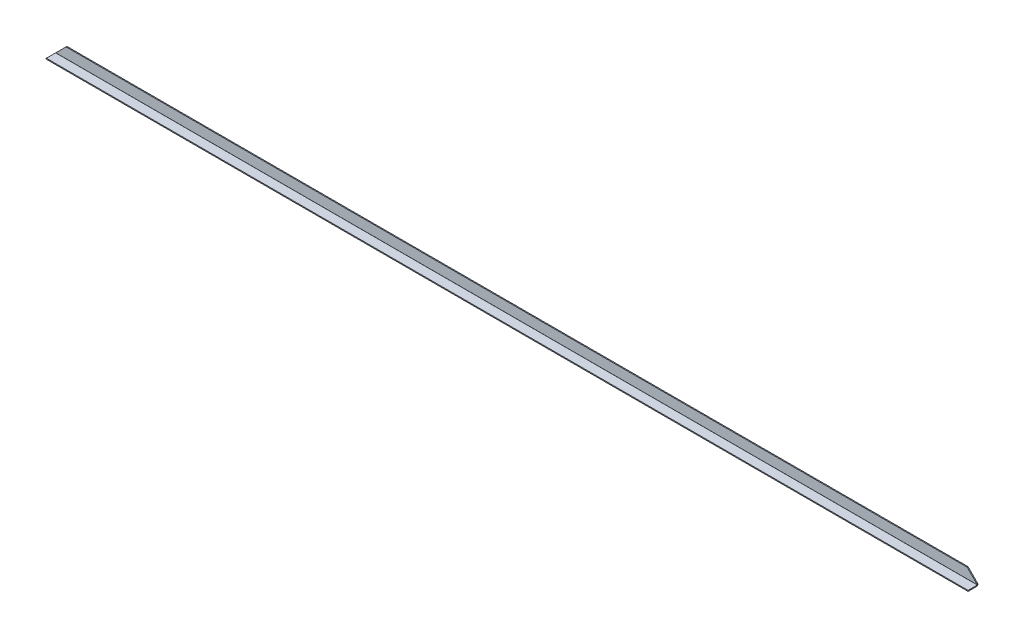
ISO-10303-21;
HEADER;
FILE_DESCRIPTION(('STEP AP214'),'2;1');
FILE_NAME('part.step','',(''),(''),'','','');
FILE_SCHEMA(('AUTOMOTIVE_DESIGN { 1 0 10303 214 1 1 1 1 }'));
ENDSEC;
DATA;
#1=APPLICATION_CONTEXT('core data for automotive mechanical design processes');
#2=APPLICATION_PROTOCOL_DEFINITION('international standard','automotive_design',2000,#1);
#3=PRODUCT_CONTEXT('',#1,'mechanical');
#4=PRODUCT('Part','Part','',(#3));
#5=PRODUCT_RELATED_PRODUCT_CATEGORY('part','',(#4));
#6=PRODUCT_DEFINITION_FORMATION('','',#4);
#7=PRODUCT_DEFINITION_CONTEXT('part definition',#1,'design');
#8=PRODUCT_DEFINITION('design','',#6,#7);
#9=PRODUCT_DEFINITION_SHAPE('','',#8);
#10=(LENGTH_UNIT() NAMED_UNIT(*) SI_UNIT(.MILLI.,.METRE.));
#11=(NAMED_UNIT(*) PLANE_ANGLE_UNIT() SI_UNIT($,.RADIAN.));
#12=(NAMED_UNIT(*) SI_UNIT($,.STERADIAN.) SOLID_ANGLE_UNIT());
#13=UNCERTAINTY_MEASURE_WITH_UNIT(LENGTH_MEASURE(1.E-05),#10,'distance_accuracy_value','');
#14=(GEOMETRIC_REPRESENTATION_CONTEXT(3) GLOBAL_UNCERTAINTY_ASSIGNED_CONTEXT((#13)) GLOBAL_UNIT_ASSIGNED_CONTEXT((#10,
#11,#12)) REPRESENTATION_CONTEXT('',''));
#15=CARTESIAN_POINT('',(0.,0.,0.));
#16=DIRECTION('',(0.,0.,1.));
#17=DIRECTION('',(1.,0.,0.));
#18=AXIS2_PLACEMENT_3D('',#15,#16,#17);
#19=CARTESIAN_POINT('',(-739.292893218814,3038.20647379484,684.763400000009));
#20=CARTESIAN_POINT('',(-739.49582060574,3038.20647379484,685.005588943309));
#21=CARTESIAN_POINT('',(-739.698563593734,3038.20647379484,685.247925149457));
#22=CARTESIAN_POINT('',(-739.889112089741,3038.20647379484,685.50000000001));
#23=B_SPLINE_CURVE_WITH_KNOTS('',3,(#19,#20,#21,#22),.UNSPECIFIED.,.F.,.F.,(4,4),(0.,1.),.UNSPECIFIED.);
#24=DIRECTION('',(0.,-1.,0.));
#25=VECTOR('',#24,1.);
#26=SURFACE_OF_LINEAR_EXTRUSION('',#23,#25);
#27=CARTESIAN_POINT('',(-739.889112089741,78.4999999999992,685.5));
#28=CARTESIAN_POINT('',(-739.84146622922,78.4999999999992,685.436969176551));
#29=CARTESIAN_POINT('',(-739.793050682681,78.4999999999992,685.374538727169));
#30=CARTESIAN_POINT('',(-739.695065923463,78.4999999999992,685.250590938683));
#31=CARTESIAN_POINT('',(-739.645496745226,78.4999999999992,685.189073572407));
#32=CARTESIAN_POINT('',(-739.495687734224,78.4999999999992,685.005521232717));
#33=CARTESIAN_POINT('',(-739.394293320919,78.4999999999992,684.884417517852));
#34=CARTESIAN_POINT('',(-739.292893218813,78.4999999999992,684.763399999999));
#35=B_SPLINE_CURVE_WITH_KNOTS('',3,(#27,#28,#29,#30,#31,#32,#33,#34),.UNSPECIFIED.,.F.,.F.,(4,2,
2,4),(0.,0.237008652066105,0.474010237128445,0.94775344184367),.UNSPECIFIED.);
#36=CARTESIAN_POINT('',(-739.889112089741,78.4999999999993,685.5));
#37=VERTEX_POINT('',#36);
#38=CARTESIAN_POINT('',(-739.292893218813,78.4999999999995,684.763399999989));
#39=VERTEX_POINT('',#38);
#40=EDGE_CURVE('E630',#37,#39,#35,.T.);
#41=ORIENTED_EDGE('',*,*,#40,.F.);
#42=DIRECTION('',(0.,-1.,0.));
#43=VECTOR('',#42,1.);
#44=CARTESIAN_POINT('',(-739.889112089741,3038.20647379484,685.50000000001));
#45=LINE('',#44,#43);
#46=CARTESIAN_POINT('',(-739.889112089741,79.9999999999996,685.5));
#47=VERTEX_POINT('',#46);
#48=EDGE_CURVE('E778',#47,#37,#45,.T.);
#49=ORIENTED_EDGE('',*,*,#48,.F.);
#50=CARTESIAN_POINT('',(-739.292893218813,79.9999999999993,684.763399999999));
#51=CARTESIAN_POINT('',(-739.49582060574,79.9999999999993,685.005588943299));
#52=CARTESIAN_POINT('',(-739.698563593734,79.9999999999993,685.247925149447));
#53=CARTESIAN_POINT('',(-739.889112089741,79.9999999999993,685.5));
#54=B_SPLINE_CURVE_WITH_KNOTS('',3,(#50,#51,#52,#53),.UNSPECIFIED.,.F.,.F.,(4,4),(0.,1.),.UNSPECIFIED.);
#55=CARTESIAN_POINT('',(-739.292893218813,79.9999999999996,684.763399999989));
#56=VERTEX_POINT('',#55);
#57=EDGE_CURVE('E73',#56,#47,#54,.T.);
#58=ORIENTED_EDGE('',*,*,#57,.F.);
#59=DIRECTION('',(0.,-1.,0.));
#60=VECTOR('',#59,1.);
#61=CARTESIAN_POINT('',(-739.292893218814,3038.20647379484,684.763399999999));
#62=LINE('',#61,#60);
#63=EDGE_CURVE('E727',#56,#39,#62,.T.);
#64=ORIENTED_EDGE('',*,*,#63,.T.);
#65=EDGE_LOOP('',(#41,#49,#58,#64));
#66=FACE_BOUND('',#65,.T.);
#67=ADVANCED_FACE('F59',(#66),#26,.F.);
#68=CARTESIAN_POINT('',(-2.52700651828484E-13,3038.20647379484,685.50000000001));
#69=DIRECTION('',(0.,0.,-1.));
#70=DIRECTION('',(0.,1.,0.));
#71=AXIS2_PLACEMENT_3D('',#68,#69,#70);
#72=PLANE('',#71);
#73=DIRECTION('',(-1.,0.,0.));
#74=VECTOR('',#73,1.);
#75=CARTESIAN_POINT('',(1.0871812735546E-13,78.4999999999996,685.5));
#76=LINE('',#75,#74);
#77=CARTESIAN_POINT('',(739.889112089738,78.4999999999996,685.499999999999));
#78=VERTEX_POINT('',#77);
#79=EDGE_CURVE('E730',#37,#78,#76,.F.);
#80=ORIENTED_EDGE('',*,*,#79,.T.);
#81=DIRECTION('',(0.,-1.,0.));
#82=VECTOR('',#81,1.);
#83=CARTESIAN_POINT('',(739.889112089738,3038.20647379484,685.500000000009));
#84=LINE('',#83,#82);
#85=CARTESIAN_POINT('',(739.889112089738,80.0000000000001,685.499999999999));
#86=VERTEX_POINT('',#85);
#87=EDGE_CURVE('E758',#86,#78,#84,.T.);
#88=ORIENTED_EDGE('',*,*,#87,.F.);
#89=DIRECTION('',(1.,0.,0.));
#90=VECTOR('',#89,1.);
#91=CARTESIAN_POINT('',(1.0853501492339E-13,79.9999999999996,685.5));
#92=LINE('',#91,#90);
#93=EDGE_CURVE('E14',#47,#86,#92,.T.);
#94=ORIENTED_EDGE('',*,*,#93,.F.);
#95=ORIENTED_EDGE('',*,*,#48,.T.);
#96=EDGE_LOOP('',(#80,#88,#94,#95));
#97=FACE_BOUND('',#96,.T.);
#98=ADVANCED_FACE('F565',(#97),#72,.F.);
#99=CARTESIAN_POINT('',(739.292893218813,3038.20647379484,684.76340000001));
#100=CARTESIAN_POINT('',(739.495796147437,3038.20647379484,685.005559752914));
#101=CARTESIAN_POINT('',(739.698625733102,3038.20647379484,685.248007353056));
#102=CARTESIAN_POINT('',(739.889112089738,3038.20647379484,685.500000000007));
#103=B_SPLINE_CURVE_WITH_KNOTS('',3,(#99,#100,#101,#102),.UNSPECIFIED.,.F.,.F.,(4,4),(0.,1.),.UNSPECIFIED.);
#104=DIRECTION('',(0.,-1.,0.));
#105=VECTOR('',#104,1.);
#106=SURFACE_OF_LINEAR_EXTRUSION('',#103,#105);
#107=ORIENTED_EDGE('',*,*,#87,.T.);
#108=CARTESIAN_POINT('',(739.889112089738,78.4999999999995,685.499999999997));
#109=CARTESIAN_POINT('',(739.841449125809,78.4999999999997,685.43694726729));
#110=CARTESIAN_POINT('',(739.793015983584,78.4999999999998,685.374495306884));
#111=CARTESIAN_POINT('',(739.694995515861,78.5,685.250504933533));
#112=CARTESIAN_POINT('',(739.645408224944,78.4999999999999,685.188966493307));
#113=CARTESIAN_POINT('',(739.495615047362,78.4999999999998,685.00543711312));
#114=CARTESIAN_POINT('',(739.394256653781,78.4999999999997,684.884375779889));
#115=CARTESIAN_POINT('',(739.292893218814,78.4999999999999,684.7634));
#116=B_SPLINE_CURVE_WITH_KNOTS('',3,(#108,#109,#110,#111,#112,#113,#114,#115),.UNSPECIFIED.,.F.,
.F.,(4,2,2,4),(0.,0.237091997989097,0.474176901016718,0.947753395880619),.UNSPECIFIED.);
#117=CARTESIAN_POINT('',(739.292893218814,78.4999999999999,684.76339999999));
#118=VERTEX_POINT('',#117);
#119=EDGE_CURVE('E623',#78,#118,#116,.T.);
#120=ORIENTED_EDGE('',*,*,#119,.T.);
#121=DIRECTION('',(0.,-1.,0.));
#122=VECTOR('',#121,1.);
#123=CARTESIAN_POINT('',(739.292893218813,3038.20647379484,684.7634));
#124=LINE('',#123,#122);
#125=CARTESIAN_POINT('',(739.292893218814,79.9999999999996,684.76339999999));
#126=VERTEX_POINT('',#125);
#127=EDGE_CURVE('E756',#126,#118,#124,.T.);
#128=ORIENTED_EDGE('',*,*,#127,.F.);
#129=CARTESIAN_POINT('',(739.292893218814,79.9999999999995,684.7634));
#130=CARTESIAN_POINT('',(739.495796147437,79.9999999999995,685.005559752904));
#131=CARTESIAN_POINT('',(739.698625733102,79.9999999999995,685.248007353046));
#132=CARTESIAN_POINT('',(739.889112089738,79.9999999999995,685.499999999997));
#133=B_SPLINE_CURVE_WITH_KNOTS('',3,(#129,#130,#131,#132),.UNSPECIFIED.,.F.,.F.,(4,4),(0.,1.),.UNSPECIFIED.);
#134=EDGE_CURVE('E760',#126,#86,#133,.T.);
#135=ORIENTED_EDGE('',*,*,#134,.T.);
#136=EDGE_LOOP('',(#107,#120,#128,#135));
#137=FACE_BOUND('',#136,.T.);
#138=ADVANCED_FACE('F570',(#137),#106,.T.);
#139=CARTESIAN_POINT('',(739.292893218813,3038.20647379484,9.99200722162641E-12));
#140=DIRECTION('',(1.,0.,0.));
#141=DIRECTION('',(0.,-1.,0.));
#142=AXIS2_PLACEMENT_3D('',#139,#140,#141);
#143=PLANE('',#142);
#144=ORIENTED_EDGE('',*,*,#127,.T.);
#145=DIRECTION('',(0.,0.,1.));
#146=VECTOR('',#145,1.);
#147=CARTESIAN_POINT('',(739.292893218814,78.4999999999999,685.5));
#148=LINE('',#147,#146);
#149=CARTESIAN_POINT('',(739.292893218814,78.4999999999997,671.23659999999));
#150=VERTEX_POINT('',#149);
#151=EDGE_CURVE('E641',#150,#118,#148,.T.);
#152=ORIENTED_EDGE('',*,*,#151,.F.);
#153=DIRECTION('',(0.,-1.,0.));
#154=VECTOR('',#153,1.);
#155=CARTESIAN_POINT('',(739.292893218814,3038.20647379484,671.2366));
#156=LINE('',#155,#154);
#157=CARTESIAN_POINT('',(739.292893218814,79.9999999999998,671.23659999999));
#158=VERTEX_POINT('',#157);
#159=EDGE_CURVE('E640',#158,#150,#156,.T.);
#160=ORIENTED_EDGE('',*,*,#159,.F.);
#161=DIRECTION('',(0.,0.,-1.));
#162=VECTOR('',#161,1.);
#163=CARTESIAN_POINT('',(739.292893218814,80.0000000000022,1.11022302462516E-13));
#164=LINE('',#163,#162);
#165=EDGE_CURVE('E762',#158,#126,#164,.F.);
#166=ORIENTED_EDGE('',*,*,#165,.T.);
#167=EDGE_LOOP('',(#144,#152,#160,#166));
#168=FACE_BOUND('',#167,.T.);
#169=ADVANCED_FACE('F576',(#168),#143,.T.);
#170=CARTESIAN_POINT('',(-739.292893218814,3038.20647379484,9.88098491916389E-12));
#171=DIRECTION('',(-1.,0.,0.));
#172=DIRECTION('',(0.,1.,0.));
#173=AXIS2_PLACEMENT_3D('',#170,#171,#172);
#174=PLANE('',#173);
#175=DIRECTION('',(0.,-1.,0.));
#176=VECTOR('',#175,1.);
#177=CARTESIAN_POINT('',(-739.292893218814,3038.20647379484,671.2366));
#178=LINE('',#177,#176);
#179=CARTESIAN_POINT('',(-739.292893218813,79.9999999999997,671.23659999999));
#180=VERTEX_POINT('',#179);
#181=CARTESIAN_POINT('',(-739.292893218813,78.4999999999995,671.23659999999));
#182=VERTEX_POINT('',#181);
#183=EDGE_CURVE('E767',#180,#182,#178,.T.);
#184=ORIENTED_EDGE('',*,*,#183,.T.);
#185=DIRECTION('',(0.,0.,1.));
#186=VECTOR('',#185,1.);
#187=CARTESIAN_POINT('',(-739.292893218813,78.4999999999996,685.5));
#188=LINE('',#187,#186);
#189=EDGE_CURVE('E673',#182,#39,#188,.T.);
#190=ORIENTED_EDGE('',*,*,#189,.T.);
#191=ORIENTED_EDGE('',*,*,#63,.F.);
#192=DIRECTION('',(0.,0.,-1.));
#193=VECTOR('',#192,1.);
#194=CARTESIAN_POINT('',(-739.292893218813,80.0000000000017,0.));
#195=LINE('',#194,#193);
#196=EDGE_CURVE('E665',#56,#180,#195,.T.);
#197=ORIENTED_EDGE('',*,*,#196,.T.);
#198=EDGE_LOOP('',(#184,#190,#191,#197));
#199=FACE_BOUND('',#198,.T.);
#200=ADVANCED_FACE('F601',(#199),#174,.T.);
#201=CARTESIAN_POINT('',(-739.292893218814,3038.20647379484,671.23660000001));
#202=CARTESIAN_POINT('',(-739.228205357178,3038.20647379484,671.134988544564));
#203=CARTESIAN_POINT('',(-739.163789295496,3038.20647379484,671.033215513255));
#204=CARTESIAN_POINT('',(-739.049089486867,3038.20647379484,670.821268268284));
#205=CARTESIAN_POINT('',(-738.999467610727,3038.20647379484,670.71191123986));
#206=CARTESIAN_POINT('',(-738.958683089955,3038.20647379484,670.600000000011));
#207=B_SPLINE_CURVE_WITH_KNOTS('',3,(#201,#202,#203,#204,#205,#206),.UNSPECIFIED.,.F.,.F.,(4,2,
4),(0.,0.5,1.),.UNSPECIFIED.);
#208=DIRECTION('',(0.,-1.,0.));
#209=VECTOR('',#208,1.);
#210=SURFACE_OF_LINEAR_EXTRUSION('',#207,#209);
#211=CARTESIAN_POINT('',(-738.958683089955,79.9999999999996,670.600000000001));
#212=DIRECTION('',(0.,-1.,0.));
#213=VECTOR('',#212,1.);
#214=LINE('',#211,#213);
#215=CARTESIAN_POINT('',(-738.958683089955,79.9999999999997,670.6));
#216=VERTEX_POINT('',#215);
#217=CARTESIAN_POINT('',(-738.958683089955,78.4999999999997,670.6));
#218=VERTEX_POINT('',#217);
#219=EDGE_CURVE('E672',#216,#218,#214,.T.);
#220=ORIENTED_EDGE('',*,*,#219,.T.);
#221=CARTESIAN_POINT('',(-738.957214469815,78.4999999998647,670.595970159815));
#222=CARTESIAN_POINT('',(-738.977750027755,78.4999999999507,670.652672024681));
#223=CARTESIAN_POINT('',(-739.000512448546,78.4999999999862,670.708557195652));
#224=CARTESIAN_POINT('',(-739.050092968141,78.5000000000124,670.818501749676));
#225=CARTESIAN_POINT('',(-739.076911025755,78.5000000000031,670.872561151267));
#226=CARTESIAN_POINT('',(-739.134290758396,78.4999999999956,670.97882136105));
#227=CARTESIAN_POINT('',(-739.164863374451,78.4999999999975,671.031016136442));
#228=CARTESIAN_POINT('',(-739.22791548687,78.5000000000012,671.134375756717));
#229=CARTESIAN_POINT('',(-739.260398099976,78.5000000000031,671.185538724355));
#230=CARTESIAN_POINT('',(-739.292893218813,78.4999999999993,671.2366));
#231=B_SPLINE_CURVE_WITH_KNOTS('',3,(#221,#222,#223,#224,#225,#226,#227,#228,#229,#230),
.UNSPECIFIED.,.F.,.F.,(4,2,2,2,4),(0.,0.18086525989436,0.361728682967934,0.543132250131995,
0.724840522158535),.UNSPECIFIED.);
#232=EDGE_CURVE('E707',#218,#182,#231,.T.);
#233=ORIENTED_EDGE('',*,*,#232,.T.);
#234=ORIENTED_EDGE('',*,*,#183,.F.);
#235=CARTESIAN_POINT('',(-739.292893218813,79.9999999999996,671.2366));
#236=CARTESIAN_POINT('',(-739.228205357178,79.9999999999996,671.134988544554));
#237=CARTESIAN_POINT('',(-739.163789295495,79.9999999999996,671.033215513245));
#238=CARTESIAN_POINT('',(-739.049089486867,79.9999999999996,670.821268268274));
#239=CARTESIAN_POINT('',(-738.999467610726,79.9999999999996,670.71191123985));
#240=CARTESIAN_POINT('',(-738.958683089955,79.9999999999996,670.600000000001));
#241=B_SPLINE_CURVE_WITH_KNOTS('',3,(#235,#236,#237,#238,#239,#240),.UNSPECIFIED.,.F.,.F.,(4,2,
4),(0.,0.5,1.),.UNSPECIFIED.);
#242=EDGE_CURVE('E703',#180,#216,#241,.T.);
#243=ORIENTED_EDGE('',*,*,#242,.T.);
#244=EDGE_LOOP('',(#220,#233,#234,#243));
#245=FACE_BOUND('',#244,.T.);
#246=ADVANCED_FACE('F596',(#245),#210,.T.);
#247=CARTESIAN_POINT('',(0.,78.5000000000019,1.11022302462516E-13));
#248=DIRECTION('',(0.,-1.,0.));
#249=DIRECTION('',(0.,0.,-1.));
#250=AXIS2_PLACEMENT_3D('',#247,#248,#249);
#251=PLANE('',#250);
#252=DIRECTION('',(-1.,0.,0.));
#253=VECTOR('',#252,1.);
#254=CARTESIAN_POINT('',(-738.958683089955,78.4999999999995,670.6));
#255=LINE('',#254,#253);
#256=CARTESIAN_POINT('',(738.958683089955,78.4999999999998,670.6));
#257=VERTEX_POINT('',#256);
#258=EDGE_CURVE('E722',#257,#218,#255,.T.);
#259=ORIENTED_EDGE('',*,*,#258,.F.);
#260=CARTESIAN_POINT('',(738.958683089955,78.4999999999996,670.6));
#261=CARTESIAN_POINT('',(738.968988421705,78.4999999999998,670.628279873762));
#262=CARTESIAN_POINT('',(738.979844085021,78.4999999999998,670.656357906757));
#263=CARTESIAN_POINT('',(739.002602043233,78.4999999999997,670.712063947291));
#264=CARTESIAN_POINT('',(739.014503603506,78.4999999999996,670.739692254797));
#265=CARTESIAN_POINT('',(739.039314285796,78.4999999999996,670.794493027585));
#266=CARTESIAN_POINT('',(739.05222344598,78.4999999999997,670.821665475551));
#267=CARTESIAN_POINT('',(739.079014678656,78.4999999999997,670.875542160706));
#268=CARTESIAN_POINT('',(739.092897166584,78.4999999999996,670.90224619181));
#269=CARTESIAN_POINT('',(739.13579419548,78.4999999999995,670.981425612631));
#270=CARTESIAN_POINT('',(739.166148138539,78.4999999999996,671.033165052155));
#271=CARTESIAN_POINT('',(739.228628658942,78.4999999999998,671.135503833935));
#272=CARTESIAN_POINT('',(739.260753405403,78.4999999999999,671.186104280306));
#273=CARTESIAN_POINT('',(739.292893218814,78.4999999999996,671.2366));
#274=B_SPLINE_CURVE_WITH_KNOTS('',3,(#260,#261,#262,#263,#264,#265,#266,#267,#268,#269,#270,
#271,#272,#273),.UNSPECIFIED.,.F.,.F.,(4,2,2,2,2,2,4),(0.,0.0902896640641582,0.180516409364814,
0.270746574151959,0.36101548826537,0.540906287238857,0.720614459105043),.UNSPECIFIED.);
#275=EDGE_CURVE('E706',#257,#150,#274,.T.);
#276=ORIENTED_EDGE('',*,*,#275,.T.);
#277=ORIENTED_EDGE('',*,*,#151,.T.);
#278=ORIENTED_EDGE('',*,*,#119,.F.);
#279=ORIENTED_EDGE('',*,*,#79,.F.);
#280=ORIENTED_EDGE('',*,*,#40,.T.);
#281=ORIENTED_EDGE('',*,*,#189,.F.);
#282=ORIENTED_EDGE('',*,*,#232,.F.);
#283=EDGE_LOOP('',(#259,#276,#277,#278,#279,#280,#281,#282));
#284=FACE_BOUND('',#283,.T.);
#285=ADVANCED_FACE('F600',(#284),#251,.T.);
#286=CARTESIAN_POINT('',(739.292893218813,3038.20647379484,671.23660000001));
#287=CARTESIAN_POINT('',(739.228342799945,3038.20647379484,671.135204439158));
#288=CARTESIAN_POINT('',(739.164061592684,3038.20647379484,671.033649018221));
#289=CARTESIAN_POINT('',(739.049552558149,3038.20647379484,670.822193162719));
#290=CARTESIAN_POINT('',(738.99977654488,3038.20647379484,670.712758943928));
#291=CARTESIAN_POINT('',(738.958683089954,3038.20647379484,670.60000000001));
#292=B_SPLINE_CURVE_WITH_KNOTS('',3,(#286,#287,#288,#289,#290,#291),.UNSPECIFIED.,.F.,.F.,(4,2,
4),(0.,0.5,1.),.UNSPECIFIED.);
#293=DIRECTION('',(0.,-1.,0.));
#294=VECTOR('',#293,1.);
#295=SURFACE_OF_LINEAR_EXTRUSION('',#292,#294);
#296=ORIENTED_EDGE('',*,*,#275,.F.);
#297=CARTESIAN_POINT('',(738.958683089955,79.9999999999996,670.6));
#298=CARTESIAN_POINT('',(738.958683089955,78.4999999999997,670.6));
#299=B_SPLINE_CURVE_WITH_KNOTS('',1,(#297,#298),.UNSPECIFIED.,.F.,.F.,(2,2),(0.,1.),.UNSPECIFIED.);
#300=CARTESIAN_POINT('',(738.958683089955,79.9999999999997,670.6));
#301=VERTEX_POINT('',#300);
#302=EDGE_CURVE('E86',#301,#257,#299,.T.);
#303=ORIENTED_EDGE('',*,*,#302,.F.);
#304=CARTESIAN_POINT('',(739.292893218814,79.9999999999998,671.2366));
#305=CARTESIAN_POINT('',(739.228342799946,79.9999999999998,671.135204439149));
#306=CARTESIAN_POINT('',(739.164061592684,79.9999999999998,671.033649018212));
#307=CARTESIAN_POINT('',(739.049552558149,79.9999999999998,670.822193162709));
#308=CARTESIAN_POINT('',(738.99977654488,79.9999999999998,670.712758943918));
#309=CARTESIAN_POINT('',(738.958683089955,79.9999999999998,670.6));
#310=B_SPLINE_CURVE_WITH_KNOTS('',3,(#304,#305,#306,#307,#308,#309),.UNSPECIFIED.,.F.,.F.,(4,2,
4),(0.,0.5,1.),.UNSPECIFIED.);
#311=EDGE_CURVE('E692',#158,#301,#310,.T.);
#312=ORIENTED_EDGE('',*,*,#311,.F.);
#313=ORIENTED_EDGE('',*,*,#159,.T.);
#314=EDGE_LOOP('',(#296,#303,#312,#313));
#315=FACE_BOUND('',#314,.T.);
#316=ADVANCED_FACE('F607',(#315),#295,.F.);
#317=CARTESIAN_POINT('',(0.,80.000000000002,1.11022302462516E-13));
#318=DIRECTION('',(0.,-1.,0.));
#319=DIRECTION('',(0.,0.,-1.));
#320=AXIS2_PLACEMENT_3D('',#317,#318,#319);
#321=PLANE('',#320);
#322=ORIENTED_EDGE('',*,*,#311,.T.);
#323=DIRECTION('',(-1.,0.,0.));
#324=VECTOR('',#323,1.);
#325=CARTESIAN_POINT('',(-738.958683089955,79.9999999999995,670.6));
#326=LINE('',#325,#324);
#327=EDGE_CURVE('E556',#301,#216,#326,.T.);
#328=ORIENTED_EDGE('',*,*,#327,.T.);
#329=ORIENTED_EDGE('',*,*,#242,.F.);
#330=ORIENTED_EDGE('',*,*,#196,.F.);
#331=ORIENTED_EDGE('',*,*,#57,.T.);
#332=ORIENTED_EDGE('',*,*,#93,.T.);
#333=ORIENTED_EDGE('',*,*,#134,.F.);
#334=ORIENTED_EDGE('',*,*,#165,.F.);
#335=EDGE_LOOP('',(#322,#328,#329,#330,#331,#332,#333,#334));
#336=FACE_BOUND('',#335,.T.);
#337=ADVANCED_FACE('F649',(#336),#321,.F.);
#338=CARTESIAN_POINT('',(0.,4.44089209850063E-12,669.000000000001));
#339=DIRECTION('',(0.,0.,1.));
#340=DIRECTION('',(0.,-1.,0.));
#341=AXIS2_PLACEMENT_3D('',#338,#339,#340);
#342=PLANE('',#341);
#343=CARTESIAN_POINT('',(-738.556293218814,80.7366000000002,669.));
#344=CARTESIAN_POINT('',(-738.60073725551,80.5246223952162,669.));
#345=CARTESIAN_POINT('',(-738.645086645381,80.3126256549142,669.));
#346=CARTESIAN_POINT('',(-738.686325339561,80.0999999999996,669.));
#347=B_SPLINE_CURVE_WITH_KNOTS('',3,(#343,#344,#345,#346),.UNSPECIFIED.,.F.,.F.,(4,4),(0.,1.),.UNSPECIFIED.);
#348=CARTESIAN_POINT('',(-738.556293218809,80.7366000000051,669.));
#349=VERTEX_POINT('',#348);
#350=CARTESIAN_POINT('',(-738.686325339561,80.1,669.));
#351=VERTEX_POINT('',#350);
#352=EDGE_CURVE('E402',#349,#351,#347,.T.);
#353=ORIENTED_EDGE('',*,*,#352,.F.);
#354=DIRECTION('',(-0.707106781186551,-0.707106781186544,0.));
#355=VECTOR('',#354,1.);
#356=CARTESIAN_POINT('',(305.980045974811,1125.27293919362,669.));
#357=LINE('',#356,#355);
#358=CARTESIAN_POINT('',(-722.792893218813,96.4999999999999,669.));
#359=VERTEX_POINT('',#358);
#360=EDGE_CURVE('E160',#359,#349,#357,.T.);
#361=ORIENTED_EDGE('',*,*,#360,.F.);
#362=DIRECTION('',(1.,0.,0.));
#363=VECTOR('',#362,1.);
#364=CARTESIAN_POINT('',(739.292893218814,96.5,669.));
#365=LINE('',#364,#363);
#366=CARTESIAN_POINT('',(722.792893218813,96.5000000000001,669.));
#367=VERTEX_POINT('',#366);
#368=EDGE_CURVE('E396',#359,#367,#365,.T.);
#369=ORIENTED_EDGE('',*,*,#368,.T.);
#370=DIRECTION('',(-0.707106781186551,0.707106781186544,0.));
#371=VECTOR('',#370,1.);
#372=CARTESIAN_POINT('',(738.556293218814,80.7365999999999,669.));
#373=LINE('',#372,#371);
#374=CARTESIAN_POINT('',(738.556293218809,80.7366000000049,669.));
#375=VERTEX_POINT('',#374);
#376=EDGE_CURVE('E249',#375,#367,#373,.T.);
#377=ORIENTED_EDGE('',*,*,#376,.F.);
#378=CARTESIAN_POINT('',(738.556293218814,80.7365999999998,669.));
#379=CARTESIAN_POINT('',(738.60073725551,80.5246223952158,669.));
#380=CARTESIAN_POINT('',(738.645086645381,80.312625654914,669.));
#381=CARTESIAN_POINT('',(738.686325339561,80.0999999999994,669.));
#382=B_SPLINE_CURVE_WITH_KNOTS('',3,(#378,#379,#380,#381),.UNSPECIFIED.,.F.,.F.,(4,4),(0.,1.),.UNSPECIFIED.);
#383=CARTESIAN_POINT('',(738.686325339561,80.0999999999999,669.));
#384=VERTEX_POINT('',#383);
#385=EDGE_CURVE('E229',#375,#384,#382,.T.);
#386=ORIENTED_EDGE('',*,*,#385,.T.);
#387=DIRECTION('',(1.,0.,0.));
#388=VECTOR('',#387,1.);
#389=CARTESIAN_POINT('',(-738.686325339561,80.1,669.));
#390=LINE('',#389,#388);
#391=EDGE_CURVE('E216',#351,#384,#390,.T.);
#392=ORIENTED_EDGE('',*,*,#391,.F.);
#393=EDGE_LOOP('',(#353,#361,#369,#377,#386,#392));
#394=FACE_BOUND('',#393,.T.);
#395=ADVANCED_FACE('F247',(#394),#342,.F.);
#396=CARTESIAN_POINT('',(-722.792893218814,96.5000000000198,3623.92734866674));
#397=DIRECTION('',(0.707106781186542,-0.707106781186553,0.));
#398=DIRECTION('',(0.707106781186553,0.707106781186542,0.));
#399=AXIS2_PLACEMENT_3D('',#396,#397,#398);
#400=PLANE('',#399);
#401=DIRECTION('',(0.,0.,-1.));
#402=VECTOR('',#401,1.);
#403=CARTESIAN_POINT('',(-722.792893218814,96.5000000000198,3623.92734866673));
#404=LINE('',#403,#402);
#405=CARTESIAN_POINT('',(-722.792893218813,96.5,670.5));
#406=VERTEX_POINT('',#405);
#407=EDGE_CURVE('E305',#406,#359,#404,.T.);
#408=ORIENTED_EDGE('',*,*,#407,.T.);
#409=ORIENTED_EDGE('',*,*,#360,.T.);
#410=DIRECTION('',(0.,0.,-1.));
#411=VECTOR('',#410,1.);
#412=CARTESIAN_POINT('',(-738.556293218809,80.7366000000249,3623.92734866674));
#413=LINE('',#412,#411);
#414=CARTESIAN_POINT('',(-738.556293218809,80.736600000005,670.5));
#415=VERTEX_POINT('',#414);
#416=EDGE_CURVE('E318',#415,#349,#413,.T.);
#417=ORIENTED_EDGE('',*,*,#416,.F.);
#418=DIRECTION('',(-0.707106781186553,-0.707106781186542,0.));
#419=VECTOR('',#418,1.);
#420=CARTESIAN_POINT('',(-722.792893218814,96.4999999999999,670.5));
#421=LINE('',#420,#419);
#422=EDGE_CURVE('E228',#406,#415,#421,.T.);
#423=ORIENTED_EDGE('',*,*,#422,.F.);
#424=EDGE_LOOP('',(#408,#409,#417,#423));
#425=FACE_BOUND('',#424,.T.);
#426=ADVANCED_FACE('F559',(#425),#400,.F.);
#427=CARTESIAN_POINT('',(-738.556293218814,80.7366000000201,3623.92734866674));
#428=CARTESIAN_POINT('',(-738.600737255511,80.524622395236,3623.92734866674));
#429=CARTESIAN_POINT('',(-738.645086645381,80.3126256549341,3623.92734866674));
#430=CARTESIAN_POINT('',(-738.686325339561,80.1000000000195,3623.92734866674));
#431=B_SPLINE_CURVE_WITH_KNOTS('',3,(#427,#428,#429,#430),.UNSPECIFIED.,.F.,.F.,(4,4),(0.,1.),.UNSPECIFIED.);
#432=DIRECTION('',(0.,0.,-1.));
#433=VECTOR('',#432,1.);
#434=SURFACE_OF_LINEAR_EXTRUSION('',#431,#433);
#435=ORIENTED_EDGE('',*,*,#416,.T.);
#436=ORIENTED_EDGE('',*,*,#352,.T.);
#437=CARTESIAN_POINT('',(-738.686325339561,80.0999999999997,670.5));
#438=CARTESIAN_POINT('',(-738.686325339561,80.1000000000002,669.));
#439=B_SPLINE_CURVE_WITH_KNOTS('',1,(#437,#438),.UNSPECIFIED.,.F.,.F.,(2,2),(0.,1.),.UNSPECIFIED.);
#440=CARTESIAN_POINT('',(-738.686325339561,80.0999999999997,670.5));
#441=VERTEX_POINT('',#440);
#442=EDGE_CURVE('E261',#441,#351,#439,.T.);
#443=ORIENTED_EDGE('',*,*,#442,.F.);
#444=CARTESIAN_POINT('',(-738.556293218814,80.7366000000002,670.5));
#445=CARTESIAN_POINT('',(-738.567404243115,80.6836055208077,670.5));
#446=CARTESIAN_POINT('',(-738.578509439191,80.6306094410506,670.5));
#447=CARTESIAN_POINT('',(-738.600613880515,80.5245951812283,670.5));
#448=CARTESIAN_POINT('',(-738.611613125683,80.4715770011463,670.5));
#449=CARTESIAN_POINT('',(-738.644309481523,80.312465881103,670.5));
#450=CARTESIAN_POINT('',(-738.665706235003,80.2063115694309,670.5));
#451=CARTESIAN_POINT('',(-738.686325339561,80.0999999999996,670.5));
#452=B_SPLINE_CURVE_WITH_KNOTS('',3,(#444,#445,#446,#447,#448,#449,#450,#451),.UNSPECIFIED.,.F.,
.F.,(4,2,2,4),(0.,0.162440904892271,0.324881932599077,0.649749289178048),.UNSPECIFIED.);
#453=EDGE_CURVE('E170',#415,#441,#452,.T.);
#454=ORIENTED_EDGE('',*,*,#453,.F.);
#455=EDGE_LOOP('',(#435,#436,#443,#454));
#456=FACE_BOUND('',#455,.T.);
#457=ADVANCED_FACE('F287',(#456),#434,.F.);
#458=CARTESIAN_POINT('',(738.556293218813,80.7366000000197,3623.92734866674));
#459=CARTESIAN_POINT('',(738.60073725551,80.5246223952357,3623.92734866674));
#460=CARTESIAN_POINT('',(738.645086645381,80.3126256549338,3623.92734866674));
#461=CARTESIAN_POINT('',(738.686325339561,80.1000000000192,3623.92734866674));
#462=B_SPLINE_CURVE_WITH_KNOTS('',3,(#458,#459,#460,#461),.UNSPECIFIED.,.F.,.F.,(4,4),(0.,1.),.UNSPECIFIED.);
#463=DIRECTION('',(0.,0.,-1.));
#464=VECTOR('',#463,1.);
#465=SURFACE_OF_LINEAR_EXTRUSION('',#462,#464);
#466=ORIENTED_EDGE('',*,*,#385,.F.);
#467=DIRECTION('',(0.,0.,-1.));
#468=VECTOR('',#467,1.);
#469=CARTESIAN_POINT('',(738.556293218806,80.7366000000273,3623.92734866674));
#470=LINE('',#469,#468);
#471=CARTESIAN_POINT('',(738.556293218806,80.7366000000075,670.5));
#472=VERTEX_POINT('',#471);
#473=EDGE_CURVE('E262',#472,#375,#470,.T.);
#474=ORIENTED_EDGE('',*,*,#473,.F.);
#475=CARTESIAN_POINT('',(738.556293218814,80.7365999999998,670.5));
#476=CARTESIAN_POINT('',(738.567404243115,80.6836055208073,670.500000000001));
#477=CARTESIAN_POINT('',(738.578509439191,80.6306094410502,670.500000000001));
#478=CARTESIAN_POINT('',(738.600613880515,80.5245951812279,670.500000000001));
#479=CARTESIAN_POINT('',(738.611613125683,80.471577001146,670.500000000001));
#480=CARTESIAN_POINT('',(738.644309481523,80.3124658811027,670.499999999999));
#481=CARTESIAN_POINT('',(738.665706235003,80.2063115694306,670.499999999999));
#482=CARTESIAN_POINT('',(738.686325339561,80.0999999999994,670.5));
#483=B_SPLINE_CURVE_WITH_KNOTS('',3,(#475,#476,#477,#478,#479,#480,#481,#482),.UNSPECIFIED.,.F.,
.F.,(4,2,2,4),(0.,0.162440904892253,0.324881932598991,0.649749289177913),.UNSPECIFIED.);
#484=CARTESIAN_POINT('',(738.686325339561,80.0999999999996,670.5));
#485=VERTEX_POINT('',#484);
#486=EDGE_CURVE('E258',#472,#485,#483,.T.);
#487=ORIENTED_EDGE('',*,*,#486,.T.);
#488=CARTESIAN_POINT('',(738.686325339561,80.0999999999994,670.5));
#489=DIRECTION('',(0.,0.,-1.));
#490=VECTOR('',#489,1.);
#491=LINE('',#488,#490);
#492=EDGE_CURVE('E237',#485,#384,#491,.T.);
#493=ORIENTED_EDGE('',*,*,#492,.T.);
#494=EDGE_LOOP('',(#466,#474,#487,#493));
#495=FACE_BOUND('',#494,.T.);
#496=ADVANCED_FACE('F256',(#495),#465,.T.);
#497=CARTESIAN_POINT('',(738.556293218813,80.7366000000198,3623.92734866674));
#498=DIRECTION('',(-0.707106781186545,-0.70710678118655,0.));
#499=DIRECTION('',(0.70710678118655,-0.707106781186545,0.));
#500=AXIS2_PLACEMENT_3D('',#497,#498,#499);
#501=PLANE('',#500);
#502=ORIENTED_EDGE('',*,*,#473,.T.);
#503=ORIENTED_EDGE('',*,*,#376,.T.);
#504=DIRECTION('',(0.,0.,-1.));
#505=VECTOR('',#504,1.);
#506=CARTESIAN_POINT('',(722.792893218813,96.5000000000199,3623.92734866674));
#507=LINE('',#506,#505);
#508=CARTESIAN_POINT('',(722.792893218813,96.5,670.5));
#509=VERTEX_POINT('',#508);
#510=EDGE_CURVE('E312',#509,#367,#507,.T.);
#511=ORIENTED_EDGE('',*,*,#510,.F.);
#512=DIRECTION('',(-0.70710678118655,0.707106781186545,0.));
#513=VECTOR('',#512,1.);
#514=CARTESIAN_POINT('',(738.556293218814,80.7366,670.5));
#515=LINE('',#514,#513);
#516=EDGE_CURVE('E323',#472,#509,#515,.T.);
#517=ORIENTED_EDGE('',*,*,#516,.F.);
#518=EDGE_LOOP('',(#502,#503,#511,#517));
#519=FACE_BOUND('',#518,.T.);
#520=ADVANCED_FACE('F286',(#519),#501,.F.);
#521=CARTESIAN_POINT('',(-2.72109174791417E-13,96.5000000000199,3623.92734866674));
#522=DIRECTION('',(0.,-1.,0.));
#523=DIRECTION('',(0.,0.,-1.));
#524=AXIS2_PLACEMENT_3D('',#521,#522,#523);
#525=PLANE('',#524);
#526=ORIENTED_EDGE('',*,*,#510,.T.);
#527=ORIENTED_EDGE('',*,*,#368,.F.);
#528=ORIENTED_EDGE('',*,*,#407,.F.);
#529=DIRECTION('',(1.,0.,0.));
#530=VECTOR('',#529,1.);
#531=CARTESIAN_POINT('',(0.,96.5000000000001,670.5));
#532=LINE('',#531,#530);
#533=EDGE_CURVE('E296',#509,#406,#532,.F.);
#534=ORIENTED_EDGE('',*,*,#533,.F.);
#535=EDGE_LOOP('',(#526,#527,#528,#534));
#536=FACE_BOUND('',#535,.T.);
#537=ADVANCED_FACE('F345',(#536),#525,.F.);
#538=CARTESIAN_POINT('',(0.,4.55191440096314E-12,670.500000000001));
#539=DIRECTION('',(0.,0.,1.));
#540=DIRECTION('',(0.,-1.,0.));
#541=AXIS2_PLACEMENT_3D('',#538,#539,#540);
#542=PLANE('',#541);
#543=ORIENTED_EDGE('',*,*,#422,.T.);
#544=ORIENTED_EDGE('',*,*,#453,.T.);
#545=DIRECTION('',(1.,0.,0.));
#546=VECTOR('',#545,1.);
#547=CARTESIAN_POINT('',(-738.686325339561,80.1,670.5));
#548=LINE('',#547,#546);
#549=EDGE_CURVE('E324',#441,#485,#548,.T.);
#550=ORIENTED_EDGE('',*,*,#549,.T.);
#551=ORIENTED_EDGE('',*,*,#486,.F.);
#552=ORIENTED_EDGE('',*,*,#516,.T.);
#553=ORIENTED_EDGE('',*,*,#533,.T.);
#554=EDGE_LOOP('',(#543,#544,#550,#551,#552,#553));
#555=FACE_BOUND('',#554,.T.);
#556=ADVANCED_FACE('F339',(#555),#542,.T.);
#557=CARTESIAN_POINT('',(738.686325339561,80.1000000000001,669.));
#558=CARTESIAN_POINT('',(738.709025863376,79.890523166693,669.));
#559=CARTESIAN_POINT('',(738.73171829796,79.6812033850252,669.041643717331));
#560=CARTESIAN_POINT('',(738.777111256359,79.2942096314065,669.201941778633));
#561=CARTESIAN_POINT('',(738.799807735558,79.11672524804,669.320533052163));
#562=CARTESIAN_POINT('',(738.845200693957,78.8205330521627,669.61672524804));
#563=CARTESIAN_POINT('',(738.867897173157,78.701941778633,669.794209631406));
#564=CARTESIAN_POINT('',(738.913290131556,78.5416437173304,670.181203385025));
#565=CARTESIAN_POINT('',(738.93598256614,78.4999999999997,670.390523166693));
#566=CARTESIAN_POINT('',(738.958683089955,78.4999999999997,670.6));
#567=CARTESIAN_POINT('',(738.686325339561,80.0999999999997,670.5));
#568=CARTESIAN_POINT('',(738.709022840167,80.0869094415233,670.5));
#569=CARTESIAN_POINT('',(738.73171829796,80.0738252115637,670.502602732333));
#570=CARTESIAN_POINT('',(738.777111256359,80.0496381019626,670.512621361165));
#571=CARTESIAN_POINT('',(738.799807735558,80.0385453280022,670.52003331576));
#572=CARTESIAN_POINT('',(738.845200693957,80.0200333157598,670.538545328003));
#573=CARTESIAN_POINT('',(738.867897173157,80.0126213611642,670.549638101963));
#574=CARTESIAN_POINT('',(738.913290131556,80.0026027323328,670.573825211564));
#575=CARTESIAN_POINT('',(738.935985589349,79.9999999999996,670.586909441524));
#576=CARTESIAN_POINT('',(738.958683089955,79.9999999999996,670.6));
#577=B_SPLINE_SURFACE_WITH_KNOTS('',1,3,((#557,#558,#559,#560,#561,#562,#563,#564,#565,#566),
(#567,#568,#569,#570,#571,#572,#573,#574,#575,#576)),.UNSPECIFIED.,.F.,.F.,.F.,(2,2),(4,2,2,2,
4),(0.,1.),(0.,0.25,0.5,0.75,1.),.UNSPECIFIED.);
#578=CARTESIAN_POINT('',(738.686325339561,80.0999999999997,670.5));
#579=CARTESIAN_POINT('',(738.709022840167,80.0869094415233,670.5));
#580=CARTESIAN_POINT('',(738.73171829796,80.0738252115637,670.502602732333));
#581=CARTESIAN_POINT('',(738.777111256359,80.0496381019626,670.512621361165));
#582=CARTESIAN_POINT('',(738.799807735558,80.0385453280022,670.52003331576));
#583=CARTESIAN_POINT('',(738.845200693957,80.0200333157598,670.538545328003));
#584=CARTESIAN_POINT('',(738.867897173157,80.0126213611642,670.549638101963));
#585=CARTESIAN_POINT('',(738.913290131556,80.0026027323328,670.573825211564));
#586=CARTESIAN_POINT('',(738.935985589349,79.9999999999996,670.586909441524));
#587=CARTESIAN_POINT('',(738.958683089955,79.9999999999996,670.6));
#588=B_SPLINE_CURVE_WITH_KNOTS('',3,(#578,#579,#580,#581,#582,#583,#584,#585,#586,#587),
.UNSPECIFIED.,.F.,.F.,(4,2,2,2,4),(0.,0.25,0.5,0.75,1.),.UNSPECIFIED.);
#589=EDGE_CURVE('E485',#485,#301,#588,.T.);
#590=CARTESIAN_POINT('',(738.958683089955,78.4999999999997,670.6));
#591=CARTESIAN_POINT('',(738.93598256614,78.4999999999997,670.390523166693));
#592=CARTESIAN_POINT('',(738.913290131556,78.5416437173304,670.181203385025));
#593=CARTESIAN_POINT('',(738.867897173157,78.701941778633,669.794209631406));
#594=CARTESIAN_POINT('',(738.845200693957,78.8205330521627,669.61672524804));
#595=CARTESIAN_POINT('',(738.799807735558,79.11672524804,669.320533052163));
#596=CARTESIAN_POINT('',(738.777111256359,79.2942096314065,669.201941778633));
#597=CARTESIAN_POINT('',(738.73171829796,79.6812033850252,669.041643717331));
#598=CARTESIAN_POINT('',(738.709025863376,79.890523166693,669.));
#599=CARTESIAN_POINT('',(738.686325339561,80.1000000000001,669.));
#600=B_SPLINE_CURVE_WITH_KNOTS('',3,(#590,#591,#592,#593,#594,#595,#596,#597,#598,#599),
.UNSPECIFIED.,.F.,.F.,(4,2,2,2,4),(0.,0.25,0.5,0.75,1.),.UNSPECIFIED.);
#601=EDGE_CURVE('E220',#384,#257,#600,.F.);
#602=ORIENTED_EDGE('',*,*,#492,.F.);
#603=ORIENTED_EDGE('',*,*,#589,.T.);
#604=ORIENTED_EDGE('',*,*,#302,.T.);
#605=ORIENTED_EDGE('',*,*,#601,.F.);
#606=EDGE_LOOP('',(#602,#603,#604,#605));
#607=FACE_BOUND('',#606,.T.);
#608=ADVANCED_FACE('F234',(#607),#577,.T.);
#609=CARTESIAN_POINT('',(-738.958683089955,78.4999999999997,670.600000000002));
#610=CARTESIAN_POINT('',(-738.93598256614,78.4999999999995,670.390523166695));
#611=CARTESIAN_POINT('',(-738.913290131556,78.5416437173301,670.181203385026));
#612=CARTESIAN_POINT('',(-738.867897173157,78.7019417786325,669.794209631407));
#613=CARTESIAN_POINT('',(-738.845200693958,78.8205330521622,669.616725248041));
#614=CARTESIAN_POINT('',(-738.799807735558,79.1167252480395,669.320533052163));
#615=CARTESIAN_POINT('',(-738.777111256359,79.2942096314061,669.201941778633));
#616=CARTESIAN_POINT('',(-738.73171829796,79.681203385025,669.041643717331));
#617=CARTESIAN_POINT('',(-738.709025863376,79.890523166693,669.));
#618=CARTESIAN_POINT('',(-738.686325339561,80.1000000000002,669.));
#619=CARTESIAN_POINT('',(-738.958683089955,79.9999999999997,670.6));
#620=CARTESIAN_POINT('',(-738.935985589349,79.9999999999997,670.586909441524));
#621=CARTESIAN_POINT('',(-738.913290131556,80.0026027323328,670.573825211564));
#622=CARTESIAN_POINT('',(-738.867897173157,80.0126213611642,670.549638101963));
#623=CARTESIAN_POINT('',(-738.845200693958,80.0200333157598,670.538545328003));
#624=CARTESIAN_POINT('',(-738.799807735558,80.0385453280022,670.52003331576));
#625=CARTESIAN_POINT('',(-738.777111256359,80.0496381019626,670.512621361165));
#626=CARTESIAN_POINT('',(-738.73171829796,80.0738252115638,670.502602732333));
#627=CARTESIAN_POINT('',(-738.709022840167,80.0869094415236,670.5));
#628=CARTESIAN_POINT('',(-738.686325339561,80.0999999999997,670.5));
#629=B_SPLINE_SURFACE_WITH_KNOTS('',1,3,((#609,#610,#611,#612,#613,#614,#615,#616,#617,#618),
(#619,#620,#621,#622,#623,#624,#625,#626,#627,#628)),.UNSPECIFIED.,.F.,.F.,.F.,(2,2),(4,2,2,2,
4),(0.,1.),(0.,0.25,0.5,0.75,1.),.UNSPECIFIED.);
#630=CARTESIAN_POINT('',(-738.958683089955,79.9999999999997,670.6));
#631=CARTESIAN_POINT('',(-738.935985589349,79.9999999999997,670.586909441524));
#632=CARTESIAN_POINT('',(-738.913290131556,80.0026027323328,670.573825211564));
#633=CARTESIAN_POINT('',(-738.867897173157,80.0126213611642,670.549638101963));
#634=CARTESIAN_POINT('',(-738.845200693958,80.0200333157598,670.538545328003));
#635=CARTESIAN_POINT('',(-738.799807735558,80.0385453280022,670.52003331576));
#636=CARTESIAN_POINT('',(-738.777111256359,80.0496381019626,670.512621361165));
#637=CARTESIAN_POINT('',(-738.73171829796,80.0738252115638,670.502602732333));
#638=CARTESIAN_POINT('',(-738.709022840167,80.0869094415236,670.5));
#639=CARTESIAN_POINT('',(-738.686325339561,80.0999999999997,670.5));
#640=B_SPLINE_CURVE_WITH_KNOTS('',3,(#630,#631,#632,#633,#634,#635,#636,#637,#638,#639),
.UNSPECIFIED.,.F.,.F.,(4,2,2,2,4),(0.,0.25,0.5,0.75,1.),.UNSPECIFIED.);
#641=EDGE_CURVE('E242',#216,#441,#640,.T.);
#642=CARTESIAN_POINT('',(-738.686325339561,80.1000000000002,669.));
#643=CARTESIAN_POINT('',(-738.709025863376,79.890523166693,669.));
#644=CARTESIAN_POINT('',(-738.73171829796,79.681203385025,669.041643717331));
#645=CARTESIAN_POINT('',(-738.777111256359,79.2942096314061,669.201941778633));
#646=CARTESIAN_POINT('',(-738.799807735558,79.1167252480395,669.320533052163));
#647=CARTESIAN_POINT('',(-738.845200693958,78.8205330521622,669.616725248041));
#648=CARTESIAN_POINT('',(-738.867897173157,78.7019417786325,669.794209631407));
#649=CARTESIAN_POINT('',(-738.913290131556,78.5416437173301,670.181203385026));
#650=CARTESIAN_POINT('',(-738.93598256614,78.4999999999995,670.390523166695));
#651=CARTESIAN_POINT('',(-738.958683089955,78.4999999999997,670.600000000002));
#652=B_SPLINE_CURVE_WITH_KNOTS('',3,(#642,#643,#644,#645,#646,#647,#648,#649,#650,#651),
.UNSPECIFIED.,.F.,.F.,(4,2,2,2,4),(0.,0.25,0.5,0.75,1.),.UNSPECIFIED.);
#653=EDGE_CURVE('E223',#218,#351,#652,.F.);
#654=ORIENTED_EDGE('',*,*,#641,.T.);
#655=ORIENTED_EDGE('',*,*,#442,.T.);
#656=ORIENTED_EDGE('',*,*,#653,.F.);
#657=ORIENTED_EDGE('',*,*,#219,.F.);
#658=EDGE_LOOP('',(#654,#655,#656,#657));
#659=FACE_BOUND('',#658,.T.);
#660=ADVANCED_FACE('F409',(#659),#629,.T.);
#661=CARTESIAN_POINT('',(-2218.94744581792,80.0999999999997,670.6));
#662=DIRECTION('',(1.,0.,0.));
#663=DIRECTION('',(0.,1.,0.));
#664=AXIS2_PLACEMENT_3D('',#661,#662,#663);
#665=CYLINDRICAL_SURFACE('',#664,1.59999999999995);
#666=ORIENTED_EDGE('',*,*,#258,.T.);
#667=ORIENTED_EDGE('',*,*,#653,.T.);
#668=ORIENTED_EDGE('',*,*,#391,.T.);
#669=ORIENTED_EDGE('',*,*,#601,.T.);
#670=EDGE_LOOP('',(#666,#667,#668,#669));
#671=FACE_BOUND('',#670,.T.);
#672=ADVANCED_FACE('F219',(#671),#665,.T.);
#673=CARTESIAN_POINT('',(-2218.94744581792,80.0999999999997,670.6));
#674=DIRECTION('',(1.,0.,0.));
#675=DIRECTION('',(0.,1.,0.));
#676=AXIS2_PLACEMENT_3D('',#673,#674,#675);
#677=CYLINDRICAL_SURFACE('',#676,0.100000000000006);
#678=ORIENTED_EDGE('',*,*,#327,.F.);
#679=ORIENTED_EDGE('',*,*,#589,.F.);
#680=ORIENTED_EDGE('',*,*,#549,.F.);
#681=ORIENTED_EDGE('',*,*,#641,.F.);
#682=EDGE_LOOP('',(#678,#679,#680,#681));
#683=FACE_BOUND('',#682,.T.);
#684=ADVANCED_FACE('F539',(#683),#677,.F.);
#685=CLOSED_SHELL('',(#67,#98,#138,#169,#200,#246,#285,#316,#337,#395,#426,#457,#496,#520,#537,
#556,#608,#660,#672,#684));
#686=MANIFOLD_SOLID_BREP('B2',#685);
#687=ADVANCED_BREP_SHAPE_REPRESENTATION('',(#18,#686),#14);
#688=SHAPE_DEFINITION_REPRESENTATION(#9,#687);
ENDSEC;
END-ISO-10303-21;
